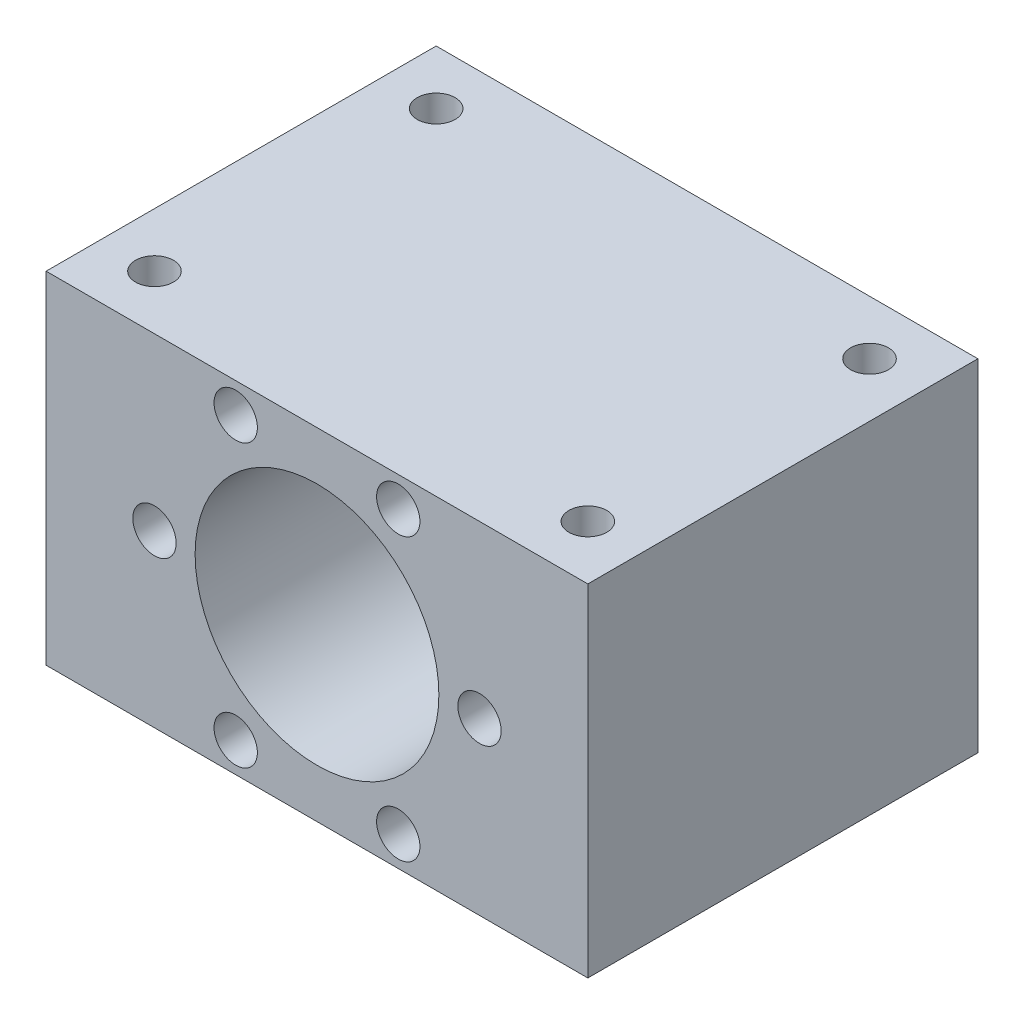
ISO-10303-21;
HEADER;
FILE_DESCRIPTION(('STEP AP214'),'2;1');
FILE_NAME('part.step','',(''),(''),'','','');
FILE_SCHEMA(('AUTOMOTIVE_DESIGN { 1 0 10303 214 1 1 1 1 }'));
ENDSEC;
DATA;
#1=APPLICATION_CONTEXT('core data for automotive mechanical design processes');
#2=APPLICATION_PROTOCOL_DEFINITION('international standard','automotive_design',2000,#1);
#3=PRODUCT_CONTEXT('',#1,'mechanical');
#4=PRODUCT('Part','Part','',(#3));
#5=PRODUCT_RELATED_PRODUCT_CATEGORY('part','',(#4));
#6=PRODUCT_DEFINITION_FORMATION('','',#4);
#7=PRODUCT_DEFINITION_CONTEXT('part definition',#1,'design');
#8=PRODUCT_DEFINITION('design','',#6,#7);
#9=PRODUCT_DEFINITION_SHAPE('','',#8);
#10=(LENGTH_UNIT() NAMED_UNIT(*) SI_UNIT(.MILLI.,.METRE.));
#11=(NAMED_UNIT(*) PLANE_ANGLE_UNIT() SI_UNIT($,.RADIAN.));
#12=(NAMED_UNIT(*) SI_UNIT($,.STERADIAN.) SOLID_ANGLE_UNIT());
#13=UNCERTAINTY_MEASURE_WITH_UNIT(LENGTH_MEASURE(1.E-05),#10,'distance_accuracy_value','');
#14=(GEOMETRIC_REPRESENTATION_CONTEXT(3) GLOBAL_UNCERTAINTY_ASSIGNED_CONTEXT((#13)) GLOBAL_UNIT_ASSIGNED_CONTEXT((#10,
#11,#12)) REPRESENTATION_CONTEXT('',''));
#15=CARTESIAN_POINT('',(0.,0.,0.));
#16=DIRECTION('',(0.,0.,1.));
#17=DIRECTION('',(1.,0.,0.));
#18=AXIS2_PLACEMENT_3D('',#15,#16,#17);
#19=CARTESIAN_POINT('',(0.,0.,36.));
#20=DIRECTION('',(0.,0.,-1.));
#21=DIRECTION('',(-1.,0.,0.));
#22=AXIS2_PLACEMENT_3D('',#19,#20,#21);
#23=PLANE('',#22);
#24=CARTESIAN_POINT('',(-7.50000000000015,12.9903810567665,36.));
#25=DIRECTION('',(0.,0.,1.));
#26=DIRECTION('',(0.50000000000001,-0.866025403784433,0.));
#27=AXIS2_PLACEMENT_3D('',#24,#25,#26);
#28=CIRCLE('',#27,2.);
#29=CARTESIAN_POINT('',(-6.50000000000013,11.2583302491976,36.));
#30=VERTEX_POINT('',#29);
#31=EDGE_CURVE('E190',#30,#30,#28,.T.);
#32=ORIENTED_EDGE('',*,*,#31,.F.);
#33=EDGE_LOOP('',(#32));
#34=FACE_BOUND('',#33,.T.);
#35=CARTESIAN_POINT('',(7.49999999999988,12.9903810567666,36.));
#36=DIRECTION('',(0.,0.,1.));
#37=DIRECTION('',(-0.499999999999992,-0.866025403784443,0.));
#38=AXIS2_PLACEMENT_3D('',#35,#36,#37);
#39=CIRCLE('',#38,2.);
#40=CARTESIAN_POINT('',(6.4999999999999,11.2583302491978,36.));
#41=VERTEX_POINT('',#40);
#42=EDGE_CURVE('E198',#41,#41,#39,.T.);
#43=ORIENTED_EDGE('',*,*,#42,.F.);
#44=EDGE_LOOP('',(#43));
#45=FACE_BOUND('',#44,.T.);
#46=CARTESIAN_POINT('',(15.,0.,36.));
#47=DIRECTION('',(0.,0.,1.));
#48=DIRECTION('',(-1.,0.,0.));
#49=AXIS2_PLACEMENT_3D('',#46,#47,#48);
#50=CIRCLE('',#49,2.);
#51=CARTESIAN_POINT('',(13.,0.,36.));
#52=VERTEX_POINT('',#51);
#53=EDGE_CURVE('E206',#52,#52,#50,.T.);
#54=ORIENTED_EDGE('',*,*,#53,.F.);
#55=EDGE_LOOP('',(#54));
#56=FACE_BOUND('',#55,.T.);
#57=CARTESIAN_POINT('',(7.50000000000006,-12.9903810567665,36.));
#58=DIRECTION('',(0.,0.,1.));
#59=DIRECTION('',(-0.500000000000004,0.866025403784436,0.));
#60=AXIS2_PLACEMENT_3D('',#57,#58,#59);
#61=CIRCLE('',#60,2.);
#62=CARTESIAN_POINT('',(6.50000000000005,-11.2583302491977,36.));
#63=VERTEX_POINT('',#62);
#64=EDGE_CURVE('E214',#63,#63,#61,.T.);
#65=ORIENTED_EDGE('',*,*,#64,.F.);
#66=EDGE_LOOP('',(#65));
#67=FACE_BOUND('',#66,.T.);
#68=CARTESIAN_POINT('',(-7.49999999999997,-12.9903810567666,36.));
#69=DIRECTION('',(0.,0.,1.));
#70=DIRECTION('',(0.499999999999998,0.86602540378444,0.));
#71=AXIS2_PLACEMENT_3D('',#68,#69,#70);
#72=CIRCLE('',#71,2.);
#73=CARTESIAN_POINT('',(-6.49999999999997,-11.2583302491977,36.));
#74=VERTEX_POINT('',#73);
#75=EDGE_CURVE('E182',#74,#74,#72,.T.);
#76=ORIENTED_EDGE('',*,*,#75,.F.);
#77=EDGE_LOOP('',(#76));
#78=FACE_BOUND('',#77,.T.);
#79=CARTESIAN_POINT('',(-15.,0.,36.));
#80=DIRECTION('',(0.,0.,1.));
#81=DIRECTION('',(1.,0.,0.));
#82=AXIS2_PLACEMENT_3D('',#79,#80,#81);
#83=CIRCLE('',#82,2.);
#84=CARTESIAN_POINT('',(-13.,0.,36.));
#85=VERTEX_POINT('',#84);
#86=EDGE_CURVE('E174',#85,#85,#83,.T.);
#87=ORIENTED_EDGE('',*,*,#86,.F.);
#88=EDGE_LOOP('',(#87));
#89=FACE_BOUND('',#88,.T.);
#90=DIRECTION('',(0.,1.,0.));
#91=VECTOR('',#90,1.);
#92=CARTESIAN_POINT('',(25.,-15.75,36.));
#93=LINE('',#92,#91);
#94=CARTESIAN_POINT('',(25.,-15.75,36.));
#95=VERTEX_POINT('',#94);
#96=CARTESIAN_POINT('',(25.,15.75,36.));
#97=VERTEX_POINT('',#96);
#98=EDGE_CURVE('E96',#95,#97,#93,.T.);
#99=ORIENTED_EDGE('',*,*,#98,.T.);
#100=DIRECTION('',(-1.,0.,0.));
#101=VECTOR('',#100,1.);
#102=CARTESIAN_POINT('',(-25.,15.75,36.));
#103=LINE('',#102,#101);
#104=CARTESIAN_POINT('',(-25.,15.75,36.));
#105=VERTEX_POINT('',#104);
#106=EDGE_CURVE('E91',#97,#105,#103,.T.);
#107=ORIENTED_EDGE('',*,*,#106,.T.);
#108=DIRECTION('',(0.,-1.,0.));
#109=VECTOR('',#108,1.);
#110=CARTESIAN_POINT('',(-25.,-15.75,36.));
#111=LINE('',#110,#109);
#112=CARTESIAN_POINT('',(-25.,-15.75,36.));
#113=VERTEX_POINT('',#112);
#114=EDGE_CURVE('E94',#105,#113,#111,.T.);
#115=ORIENTED_EDGE('',*,*,#114,.T.);
#116=DIRECTION('',(1.,0.,0.));
#117=VECTOR('',#116,1.);
#118=CARTESIAN_POINT('',(-25.,-15.75,36.));
#119=LINE('',#118,#117);
#120=EDGE_CURVE('E61',#113,#95,#119,.T.);
#121=ORIENTED_EDGE('',*,*,#120,.T.);
#122=EDGE_LOOP('',(#99,#107,#115,#121));
#123=FACE_BOUND('',#122,.T.);
#124=CARTESIAN_POINT('',(0.,0.,36.));
#125=DIRECTION('',(0.,0.,1.));
#126=DIRECTION('',(1.,0.,0.));
#127=AXIS2_PLACEMENT_3D('',#124,#125,#126);
#128=CIRCLE('',#127,11.25);
#129=CARTESIAN_POINT('',(11.25,0.,36.));
#130=VERTEX_POINT('',#129);
#131=EDGE_CURVE('E116',#130,#130,#128,.T.);
#132=ORIENTED_EDGE('',*,*,#131,.F.);
#133=EDGE_LOOP('',(#132));
#134=FACE_BOUND('',#133,.T.);
#135=ADVANCED_FACE('F43',(#34,#45,#56,#67,#78,#89,#123,#134),#23,.F.);
#136=CARTESIAN_POINT('',(0.,0.,0.));
#137=DIRECTION('',(0.,0.,-1.));
#138=DIRECTION('',(-1.,0.,0.));
#139=AXIS2_PLACEMENT_3D('',#136,#137,#138);
#140=PLANE('',#139);
#141=DIRECTION('',(0.,1.,0.));
#142=VECTOR('',#141,1.);
#143=CARTESIAN_POINT('',(25.,-15.75,0.));
#144=LINE('',#143,#142);
#145=CARTESIAN_POINT('',(25.,-15.75,0.));
#146=VERTEX_POINT('',#145);
#147=CARTESIAN_POINT('',(25.,15.75,0.));
#148=VERTEX_POINT('',#147);
#149=EDGE_CURVE('E112',#146,#148,#144,.T.);
#150=ORIENTED_EDGE('',*,*,#149,.F.);
#151=DIRECTION('',(1.,0.,0.));
#152=VECTOR('',#151,1.);
#153=CARTESIAN_POINT('',(-25.,-15.75,0.));
#154=LINE('',#153,#152);
#155=CARTESIAN_POINT('',(-25.,-15.75,0.));
#156=VERTEX_POINT('',#155);
#157=EDGE_CURVE('E84',#156,#146,#154,.T.);
#158=ORIENTED_EDGE('',*,*,#157,.F.);
#159=DIRECTION('',(0.,-1.,0.));
#160=VECTOR('',#159,1.);
#161=CARTESIAN_POINT('',(-25.,-15.75,0.));
#162=LINE('',#161,#160);
#163=CARTESIAN_POINT('',(-25.,15.75,0.));
#164=VERTEX_POINT('',#163);
#165=EDGE_CURVE('E78',#164,#156,#162,.T.);
#166=ORIENTED_EDGE('',*,*,#165,.F.);
#167=DIRECTION('',(-1.,0.,0.));
#168=VECTOR('',#167,1.);
#169=CARTESIAN_POINT('',(-25.,15.75,0.));
#170=LINE('',#169,#168);
#171=EDGE_CURVE('E101',#148,#164,#170,.T.);
#172=ORIENTED_EDGE('',*,*,#171,.F.);
#173=EDGE_LOOP('',(#150,#158,#166,#172));
#174=FACE_BOUND('',#173,.T.);
#175=CARTESIAN_POINT('',(0.,0.,0.));
#176=DIRECTION('',(0.,0.,1.));
#177=DIRECTION('',(1.,0.,0.));
#178=AXIS2_PLACEMENT_3D('',#175,#176,#177);
#179=CIRCLE('',#178,11.25);
#180=CARTESIAN_POINT('',(11.25,0.,0.));
#181=VERTEX_POINT('',#180);
#182=EDGE_CURVE('E134',#181,#181,#179,.T.);
#183=ORIENTED_EDGE('',*,*,#182,.T.);
#184=EDGE_LOOP('',(#183));
#185=FACE_BOUND('',#184,.T.);
#186=ADVANCED_FACE('F129',(#174,#185),#140,.T.);
#187=CARTESIAN_POINT('',(25.,-15.75,36.));
#188=DIRECTION('',(-1.,0.,0.));
#189=DIRECTION('',(0.,0.,1.));
#190=AXIS2_PLACEMENT_3D('',#187,#188,#189);
#191=PLANE('',#190);
#192=ORIENTED_EDGE('',*,*,#149,.T.);
#193=DIRECTION('',(0.,0.,-1.));
#194=VECTOR('',#193,1.);
#195=CARTESIAN_POINT('',(25.,15.75,36.));
#196=LINE('',#195,#194);
#197=EDGE_CURVE('E11',#97,#148,#196,.T.);
#198=ORIENTED_EDGE('',*,*,#197,.F.);
#199=ORIENTED_EDGE('',*,*,#98,.F.);
#200=DIRECTION('',(0.,0.,-1.));
#201=VECTOR('',#200,1.);
#202=CARTESIAN_POINT('',(25.,-15.75,36.));
#203=LINE('',#202,#201);
#204=EDGE_CURVE('E108',#95,#146,#203,.T.);
#205=ORIENTED_EDGE('',*,*,#204,.T.);
#206=EDGE_LOOP('',(#192,#198,#199,#205));
#207=FACE_BOUND('',#206,.T.);
#208=ADVANCED_FACE('F45',(#207),#191,.F.);
#209=CARTESIAN_POINT('',(-25.,15.75,36.));
#210=DIRECTION('',(0.,-1.,0.));
#211=DIRECTION('',(0.,0.,-1.));
#212=AXIS2_PLACEMENT_3D('',#209,#210,#211);
#213=PLANE('',#212);
#214=CARTESIAN_POINT('',(-20.,15.75,31.));
#215=DIRECTION('',(0.,1.,0.));
#216=DIRECTION('',(0.,0.,1.));
#217=AXIS2_PLACEMENT_3D('',#214,#215,#216);
#218=CIRCLE('',#217,1.75);
#219=CARTESIAN_POINT('',(-20.,15.75,32.75));
#220=VERTEX_POINT('',#219);
#221=EDGE_CURVE('E154',#220,#220,#218,.T.);
#222=ORIENTED_EDGE('',*,*,#221,.F.);
#223=EDGE_LOOP('',(#222));
#224=FACE_BOUND('',#223,.T.);
#225=CARTESIAN_POINT('',(20.,15.75,31.));
#226=DIRECTION('',(0.,1.,0.));
#227=DIRECTION('',(0.,0.,1.));
#228=AXIS2_PLACEMENT_3D('',#225,#226,#227);
#229=CIRCLE('',#228,1.75);
#230=CARTESIAN_POINT('',(20.,15.75,32.75));
#231=VERTEX_POINT('',#230);
#232=EDGE_CURVE('E163',#231,#231,#229,.T.);
#233=ORIENTED_EDGE('',*,*,#232,.F.);
#234=EDGE_LOOP('',(#233));
#235=FACE_BOUND('',#234,.T.);
#236=CARTESIAN_POINT('',(20.,15.75,5.));
#237=DIRECTION('',(0.,1.,0.));
#238=DIRECTION('',(0.,0.,1.));
#239=AXIS2_PLACEMENT_3D('',#236,#237,#238);
#240=CIRCLE('',#239,1.75);
#241=CARTESIAN_POINT('',(20.,15.75,6.75));
#242=VERTEX_POINT('',#241);
#243=EDGE_CURVE('E146',#242,#242,#240,.T.);
#244=ORIENTED_EDGE('',*,*,#243,.F.);
#245=EDGE_LOOP('',(#244));
#246=FACE_BOUND('',#245,.T.);
#247=CARTESIAN_POINT('',(-20.,15.75,5.));
#248=DIRECTION('',(0.,1.,0.));
#249=DIRECTION('',(0.,0.,1.));
#250=AXIS2_PLACEMENT_3D('',#247,#248,#249);
#251=CIRCLE('',#250,1.75);
#252=CARTESIAN_POINT('',(-20.,15.75,6.75));
#253=VERTEX_POINT('',#252);
#254=EDGE_CURVE('E142',#253,#253,#251,.T.);
#255=ORIENTED_EDGE('',*,*,#254,.F.);
#256=EDGE_LOOP('',(#255));
#257=FACE_BOUND('',#256,.T.);
#258=ORIENTED_EDGE('',*,*,#171,.T.);
#259=DIRECTION('',(0.,0.,-1.));
#260=VECTOR('',#259,1.);
#261=CARTESIAN_POINT('',(-25.,15.75,36.));
#262=LINE('',#261,#260);
#263=EDGE_CURVE('E53',#105,#164,#262,.T.);
#264=ORIENTED_EDGE('',*,*,#263,.F.);
#265=ORIENTED_EDGE('',*,*,#106,.F.);
#266=ORIENTED_EDGE('',*,*,#197,.T.);
#267=EDGE_LOOP('',(#258,#264,#265,#266));
#268=FACE_BOUND('',#267,.T.);
#269=ADVANCED_FACE('F100',(#224,#235,#246,#257,#268),#213,.F.);
#270=CARTESIAN_POINT('',(-25.,-15.75,36.));
#271=DIRECTION('',(1.,0.,0.));
#272=DIRECTION('',(0.,0.,-1.));
#273=AXIS2_PLACEMENT_3D('',#270,#271,#272);
#274=PLANE('',#273);
#275=ORIENTED_EDGE('',*,*,#165,.T.);
#276=DIRECTION('',(0.,0.,-1.));
#277=VECTOR('',#276,1.);
#278=CARTESIAN_POINT('',(-25.,-15.75,36.));
#279=LINE('',#278,#277);
#280=EDGE_CURVE('E103',#113,#156,#279,.T.);
#281=ORIENTED_EDGE('',*,*,#280,.F.);
#282=ORIENTED_EDGE('',*,*,#114,.F.);
#283=ORIENTED_EDGE('',*,*,#263,.T.);
#284=EDGE_LOOP('',(#275,#281,#282,#283));
#285=FACE_BOUND('',#284,.T.);
#286=ADVANCED_FACE('F104',(#285),#274,.F.);
#287=CARTESIAN_POINT('',(-25.,-15.75,36.));
#288=DIRECTION('',(0.,1.,0.));
#289=DIRECTION('',(0.,0.,1.));
#290=AXIS2_PLACEMENT_3D('',#287,#288,#289);
#291=PLANE('',#290);
#292=ORIENTED_EDGE('',*,*,#157,.T.);
#293=ORIENTED_EDGE('',*,*,#204,.F.);
#294=ORIENTED_EDGE('',*,*,#120,.F.);
#295=ORIENTED_EDGE('',*,*,#280,.T.);
#296=EDGE_LOOP('',(#292,#293,#294,#295));
#297=FACE_BOUND('',#296,.T.);
#298=ADVANCED_FACE('F126',(#297),#291,.F.);
#299=CARTESIAN_POINT('',(0.,0.,36.));
#300=DIRECTION('',(0.,0.,-1.));
#301=DIRECTION('',(-1.,0.,0.));
#302=AXIS2_PLACEMENT_3D('',#299,#300,#301);
#303=CYLINDRICAL_SURFACE('',#302,11.25);
#304=ORIENTED_EDGE('',*,*,#131,.T.);
#305=EDGE_LOOP('',(#304));
#306=FACE_BOUND('',#305,.T.);
#307=ORIENTED_EDGE('',*,*,#182,.F.);
#308=EDGE_LOOP('',(#307));
#309=FACE_BOUND('',#308,.T.);
#310=ADVANCED_FACE('F284',(#306,#309),#303,.F.);
#311=CARTESIAN_POINT('',(-20.,5.75,5.));
#312=DIRECTION('',(0.,1.,0.));
#313=DIRECTION('',(0.,0.,1.));
#314=AXIS2_PLACEMENT_3D('',#311,#312,#313);
#315=CYLINDRICAL_SURFACE('',#314,1.75);
#316=CARTESIAN_POINT('',(-20.,5.75,5.));
#317=DIRECTION('',(0.,1.,0.));
#318=DIRECTION('',(0.,0.,1.));
#319=AXIS2_PLACEMENT_3D('',#316,#317,#318);
#320=CIRCLE('',#319,1.75);
#321=CARTESIAN_POINT('',(-20.,5.75,6.75));
#322=VERTEX_POINT('',#321);
#323=EDGE_CURVE('E138',#322,#322,#320,.T.);
#324=ORIENTED_EDGE('',*,*,#323,.F.);
#325=EDGE_LOOP('',(#324));
#326=FACE_BOUND('',#325,.T.);
#327=ORIENTED_EDGE('',*,*,#254,.T.);
#328=EDGE_LOOP('',(#327));
#329=FACE_BOUND('',#328,.T.);
#330=ADVANCED_FACE('F280',(#326,#329),#315,.F.);
#331=CARTESIAN_POINT('',(-20.,5.75,5.));
#332=DIRECTION('',(0.,1.,0.));
#333=DIRECTION('',(0.,0.,1.));
#334=AXIS2_PLACEMENT_3D('',#331,#332,#333);
#335=PLANE('',#334);
#336=ORIENTED_EDGE('',*,*,#323,.T.);
#337=EDGE_LOOP('',(#336));
#338=FACE_BOUND('',#337,.T.);
#339=ADVANCED_FACE('F262',(#338),#335,.T.);
#340=CARTESIAN_POINT('',(20.,5.75,5.));
#341=DIRECTION('',(0.,1.,0.));
#342=DIRECTION('',(0.,0.,1.));
#343=AXIS2_PLACEMENT_3D('',#340,#341,#342);
#344=CYLINDRICAL_SURFACE('',#343,1.75);
#345=CARTESIAN_POINT('',(20.,5.75,5.));
#346=DIRECTION('',(0.,1.,0.));
#347=DIRECTION('',(0.,0.,1.));
#348=AXIS2_PLACEMENT_3D('',#345,#346,#347);
#349=CIRCLE('',#348,1.75);
#350=CARTESIAN_POINT('',(20.,5.75,6.75));
#351=VERTEX_POINT('',#350);
#352=EDGE_CURVE('E167',#351,#351,#349,.T.);
#353=ORIENTED_EDGE('',*,*,#352,.F.);
#354=EDGE_LOOP('',(#353));
#355=FACE_BOUND('',#354,.T.);
#356=ORIENTED_EDGE('',*,*,#243,.T.);
#357=EDGE_LOOP('',(#356));
#358=FACE_BOUND('',#357,.T.);
#359=ADVANCED_FACE('F258',(#355,#358),#344,.F.);
#360=CARTESIAN_POINT('',(20.,5.75,5.));
#361=DIRECTION('',(0.,1.,0.));
#362=DIRECTION('',(0.,0.,1.));
#363=AXIS2_PLACEMENT_3D('',#360,#361,#362);
#364=PLANE('',#363);
#365=ORIENTED_EDGE('',*,*,#352,.T.);
#366=EDGE_LOOP('',(#365));
#367=FACE_BOUND('',#366,.T.);
#368=ADVANCED_FACE('F261',(#367),#364,.T.);
#369=CARTESIAN_POINT('',(20.,5.75,31.));
#370=DIRECTION('',(0.,1.,0.));
#371=DIRECTION('',(0.,0.,1.));
#372=AXIS2_PLACEMENT_3D('',#369,#370,#371);
#373=CYLINDRICAL_SURFACE('',#372,1.75);
#374=CARTESIAN_POINT('',(20.,5.75,31.));
#375=DIRECTION('',(0.,1.,0.));
#376=DIRECTION('',(0.,0.,1.));
#377=AXIS2_PLACEMENT_3D('',#374,#375,#376);
#378=CIRCLE('',#377,1.75);
#379=CARTESIAN_POINT('',(20.,5.75,32.75));
#380=VERTEX_POINT('',#379);
#381=EDGE_CURVE('E159',#380,#380,#378,.T.);
#382=ORIENTED_EDGE('',*,*,#381,.F.);
#383=EDGE_LOOP('',(#382));
#384=FACE_BOUND('',#383,.T.);
#385=ORIENTED_EDGE('',*,*,#232,.T.);
#386=EDGE_LOOP('',(#385));
#387=FACE_BOUND('',#386,.T.);
#388=ADVANCED_FACE('F266',(#384,#387),#373,.F.);
#389=CARTESIAN_POINT('',(20.,5.75,31.));
#390=DIRECTION('',(0.,1.,0.));
#391=DIRECTION('',(0.,0.,1.));
#392=AXIS2_PLACEMENT_3D('',#389,#390,#391);
#393=PLANE('',#392);
#394=ORIENTED_EDGE('',*,*,#381,.T.);
#395=EDGE_LOOP('',(#394));
#396=FACE_BOUND('',#395,.T.);
#397=ADVANCED_FACE('F270',(#396),#393,.T.);
#398=CARTESIAN_POINT('',(-20.,5.75,31.));
#399=DIRECTION('',(0.,1.,0.));
#400=DIRECTION('',(0.,0.,1.));
#401=AXIS2_PLACEMENT_3D('',#398,#399,#400);
#402=CYLINDRICAL_SURFACE('',#401,1.75);
#403=CARTESIAN_POINT('',(-20.,5.75,31.));
#404=DIRECTION('',(0.,1.,0.));
#405=DIRECTION('',(0.,0.,1.));
#406=AXIS2_PLACEMENT_3D('',#403,#404,#405);
#407=CIRCLE('',#406,1.75);
#408=CARTESIAN_POINT('',(-20.,5.75,32.75));
#409=VERTEX_POINT('',#408);
#410=EDGE_CURVE('E150',#409,#409,#407,.T.);
#411=ORIENTED_EDGE('',*,*,#410,.F.);
#412=EDGE_LOOP('',(#411));
#413=FACE_BOUND('',#412,.T.);
#414=ORIENTED_EDGE('',*,*,#221,.T.);
#415=EDGE_LOOP('',(#414));
#416=FACE_BOUND('',#415,.T.);
#417=ADVANCED_FACE('F252',(#413,#416),#402,.F.);
#418=CARTESIAN_POINT('',(-20.,5.75,31.));
#419=DIRECTION('',(0.,1.,0.));
#420=DIRECTION('',(0.,0.,1.));
#421=AXIS2_PLACEMENT_3D('',#418,#419,#420);
#422=PLANE('',#421);
#423=ORIENTED_EDGE('',*,*,#410,.T.);
#424=EDGE_LOOP('',(#423));
#425=FACE_BOUND('',#424,.T.);
#426=ADVANCED_FACE('F242',(#425),#422,.T.);
#427=CARTESIAN_POINT('',(-15.,0.,18.));
#428=DIRECTION('',(0.,0.,1.));
#429=DIRECTION('',(1.,0.,0.));
#430=AXIS2_PLACEMENT_3D('',#427,#428,#429);
#431=CYLINDRICAL_SURFACE('',#430,2.);
#432=CARTESIAN_POINT('',(-15.,0.,18.));
#433=DIRECTION('',(0.,0.,1.));
#434=DIRECTION('',(1.,0.,0.));
#435=AXIS2_PLACEMENT_3D('',#432,#433,#434);
#436=CIRCLE('',#435,2.);
#437=CARTESIAN_POINT('',(-13.,0.,18.));
#438=VERTEX_POINT('',#437);
#439=EDGE_CURVE('E155',#438,#438,#436,.T.);
#440=ORIENTED_EDGE('',*,*,#439,.F.);
#441=EDGE_LOOP('',(#440));
#442=FACE_BOUND('',#441,.T.);
#443=ORIENTED_EDGE('',*,*,#86,.T.);
#444=EDGE_LOOP('',(#443));
#445=FACE_BOUND('',#444,.T.);
#446=ADVANCED_FACE('F239',(#442,#445),#431,.F.);
#447=CARTESIAN_POINT('',(-15.,0.,18.));
#448=DIRECTION('',(0.,0.,1.));
#449=DIRECTION('',(1.,0.,0.));
#450=AXIS2_PLACEMENT_3D('',#447,#448,#449);
#451=PLANE('',#450);
#452=ORIENTED_EDGE('',*,*,#439,.T.);
#453=EDGE_LOOP('',(#452));
#454=FACE_BOUND('',#453,.T.);
#455=ADVANCED_FACE('F241',(#454),#451,.T.);
#456=CARTESIAN_POINT('',(-7.49999999999997,-12.9903810567666,18.));
#457=DIRECTION('',(0.,0.,1.));
#458=DIRECTION('',(1.,0.,0.));
#459=AXIS2_PLACEMENT_3D('',#456,#457,#458);
#460=CYLINDRICAL_SURFACE('',#459,2.);
#461=CARTESIAN_POINT('',(-7.49999999999997,-12.9903810567666,18.));
#462=DIRECTION('',(0.,0.,1.));
#463=DIRECTION('',(0.499999999999998,0.86602540378444,0.));
#464=AXIS2_PLACEMENT_3D('',#461,#462,#463);
#465=CIRCLE('',#464,2.);
#466=CARTESIAN_POINT('',(-6.49999999999997,-11.2583302491977,18.));
#467=VERTEX_POINT('',#466);
#468=EDGE_CURVE('E178',#467,#467,#465,.T.);
#469=ORIENTED_EDGE('',*,*,#468,.F.);
#470=EDGE_LOOP('',(#469));
#471=FACE_BOUND('',#470,.T.);
#472=ORIENTED_EDGE('',*,*,#75,.T.);
#473=EDGE_LOOP('',(#472));
#474=FACE_BOUND('',#473,.T.);
#475=ADVANCED_FACE('F249',(#471,#474),#460,.F.);
#476=CARTESIAN_POINT('',(-7.49999999999997,-12.9903810567666,18.));
#477=DIRECTION('',(0.,0.,1.));
#478=DIRECTION('',(0.499999999999998,0.86602540378444,0.));
#479=AXIS2_PLACEMENT_3D('',#476,#477,#478);
#480=PLANE('',#479);
#481=ORIENTED_EDGE('',*,*,#468,.T.);
#482=EDGE_LOOP('',(#481));
#483=FACE_BOUND('',#482,.T.);
#484=ADVANCED_FACE('F227',(#483),#480,.T.);
#485=CARTESIAN_POINT('',(7.50000000000006,-12.9903810567665,18.));
#486=DIRECTION('',(0.,0.,1.));
#487=DIRECTION('',(1.,0.,0.));
#488=AXIS2_PLACEMENT_3D('',#485,#486,#487);
#489=CYLINDRICAL_SURFACE('',#488,2.);
#490=CARTESIAN_POINT('',(7.50000000000006,-12.9903810567665,18.));
#491=DIRECTION('',(0.,0.,1.));
#492=DIRECTION('',(-0.500000000000004,0.866025403784436,0.));
#493=AXIS2_PLACEMENT_3D('',#490,#491,#492);
#494=CIRCLE('',#493,2.);
#495=CARTESIAN_POINT('',(6.50000000000005,-11.2583302491977,18.));
#496=VERTEX_POINT('',#495);
#497=EDGE_CURVE('E186',#496,#496,#494,.T.);
#498=ORIENTED_EDGE('',*,*,#497,.F.);
#499=EDGE_LOOP('',(#498));
#500=FACE_BOUND('',#499,.T.);
#501=ORIENTED_EDGE('',*,*,#64,.T.);
#502=EDGE_LOOP('',(#501));
#503=FACE_BOUND('',#502,.T.);
#504=ADVANCED_FACE('F224',(#500,#503),#489,.F.);
#505=CARTESIAN_POINT('',(7.50000000000006,-12.9903810567665,18.));
#506=DIRECTION('',(0.,0.,1.));
#507=DIRECTION('',(-0.500000000000004,0.866025403784436,0.));
#508=AXIS2_PLACEMENT_3D('',#505,#506,#507);
#509=PLANE('',#508);
#510=ORIENTED_EDGE('',*,*,#497,.T.);
#511=EDGE_LOOP('',(#510));
#512=FACE_BOUND('',#511,.T.);
#513=ADVANCED_FACE('F222',(#512),#509,.T.);
#514=CARTESIAN_POINT('',(15.,0.,18.));
#515=DIRECTION('',(0.,0.,1.));
#516=DIRECTION('',(1.,0.,0.));
#517=AXIS2_PLACEMENT_3D('',#514,#515,#516);
#518=CYLINDRICAL_SURFACE('',#517,2.);
#519=CARTESIAN_POINT('',(15.,0.,18.));
#520=DIRECTION('',(0.,0.,1.));
#521=DIRECTION('',(-1.,0.,0.));
#522=AXIS2_PLACEMENT_3D('',#519,#520,#521);
#523=CIRCLE('',#522,2.);
#524=CARTESIAN_POINT('',(13.,0.,18.));
#525=VERTEX_POINT('',#524);
#526=EDGE_CURVE('E210',#525,#525,#523,.T.);
#527=ORIENTED_EDGE('',*,*,#526,.F.);
#528=EDGE_LOOP('',(#527));
#529=FACE_BOUND('',#528,.T.);
#530=ORIENTED_EDGE('',*,*,#53,.T.);
#531=EDGE_LOOP('',(#530));
#532=FACE_BOUND('',#531,.T.);
#533=ADVANCED_FACE('F360',(#529,#532),#518,.F.);
#534=CARTESIAN_POINT('',(15.,0.,18.));
#535=DIRECTION('',(0.,0.,1.));
#536=DIRECTION('',(-1.,0.,0.));
#537=AXIS2_PLACEMENT_3D('',#534,#535,#536);
#538=PLANE('',#537);
#539=ORIENTED_EDGE('',*,*,#526,.T.);
#540=EDGE_LOOP('',(#539));
#541=FACE_BOUND('',#540,.T.);
#542=ADVANCED_FACE('F370',(#541),#538,.T.);
#543=CARTESIAN_POINT('',(7.49999999999988,12.9903810567666,18.));
#544=DIRECTION('',(0.,0.,1.));
#545=DIRECTION('',(1.,0.,0.));
#546=AXIS2_PLACEMENT_3D('',#543,#544,#545);
#547=CYLINDRICAL_SURFACE('',#546,2.);
#548=CARTESIAN_POINT('',(7.49999999999988,12.9903810567666,18.));
#549=DIRECTION('',(0.,0.,1.));
#550=DIRECTION('',(-0.499999999999992,-0.866025403784443,0.));
#551=AXIS2_PLACEMENT_3D('',#548,#549,#550);
#552=CIRCLE('',#551,2.);
#553=CARTESIAN_POINT('',(6.4999999999999,11.2583302491978,18.));
#554=VERTEX_POINT('',#553);
#555=EDGE_CURVE('E202',#554,#554,#552,.T.);
#556=ORIENTED_EDGE('',*,*,#555,.F.);
#557=EDGE_LOOP('',(#556));
#558=FACE_BOUND('',#557,.T.);
#559=ORIENTED_EDGE('',*,*,#42,.T.);
#560=EDGE_LOOP('',(#559));
#561=FACE_BOUND('',#560,.T.);
#562=ADVANCED_FACE('F381',(#558,#561),#547,.F.);
#563=CARTESIAN_POINT('',(7.49999999999988,12.9903810567666,18.));
#564=DIRECTION('',(0.,0.,1.));
#565=DIRECTION('',(-0.499999999999992,-0.866025403784443,0.));
#566=AXIS2_PLACEMENT_3D('',#563,#564,#565);
#567=PLANE('',#566);
#568=ORIENTED_EDGE('',*,*,#555,.T.);
#569=EDGE_LOOP('',(#568));
#570=FACE_BOUND('',#569,.T.);
#571=ADVANCED_FACE('F392',(#570),#567,.T.);
#572=CARTESIAN_POINT('',(-7.50000000000015,12.9903810567665,18.));
#573=DIRECTION('',(0.,0.,1.));
#574=DIRECTION('',(1.,0.,0.));
#575=AXIS2_PLACEMENT_3D('',#572,#573,#574);
#576=CYLINDRICAL_SURFACE('',#575,2.);
#577=CARTESIAN_POINT('',(-7.50000000000015,12.9903810567665,18.));
#578=DIRECTION('',(0.,0.,1.));
#579=DIRECTION('',(0.50000000000001,-0.866025403784433,0.));
#580=AXIS2_PLACEMENT_3D('',#577,#578,#579);
#581=CIRCLE('',#580,2.);
#582=CARTESIAN_POINT('',(-6.50000000000013,11.2583302491976,18.));
#583=VERTEX_POINT('',#582);
#584=EDGE_CURVE('E194',#583,#583,#581,.T.);
#585=ORIENTED_EDGE('',*,*,#584,.F.);
#586=EDGE_LOOP('',(#585));
#587=FACE_BOUND('',#586,.T.);
#588=ORIENTED_EDGE('',*,*,#31,.T.);
#589=EDGE_LOOP('',(#588));
#590=FACE_BOUND('',#589,.T.);
#591=ADVANCED_FACE('F403',(#587,#590),#576,.F.);
#592=CARTESIAN_POINT('',(-7.50000000000015,12.9903810567665,18.));
#593=DIRECTION('',(0.,0.,1.));
#594=DIRECTION('',(0.50000000000001,-0.866025403784433,0.));
#595=AXIS2_PLACEMENT_3D('',#592,#593,#594);
#596=PLANE('',#595);
#597=ORIENTED_EDGE('',*,*,#584,.T.);
#598=EDGE_LOOP('',(#597));
#599=FACE_BOUND('',#598,.T.);
#600=ADVANCED_FACE('F414',(#599),#596,.T.);
#601=CLOSED_SHELL('',(#135,#186,#208,#269,#286,#298,#310,#330,#339,#359,#368,#388,#397,#417,
#426,#446,#455,#475,#484,#504,#513,#533,#542,#562,#571,#591,#600));
#602=MANIFOLD_SOLID_BREP('B2',#601);
#603=ADVANCED_BREP_SHAPE_REPRESENTATION('',(#18,#602),#14);
#604=SHAPE_DEFINITION_REPRESENTATION(#9,#603);
ENDSEC;
END-ISO-10303-21;
